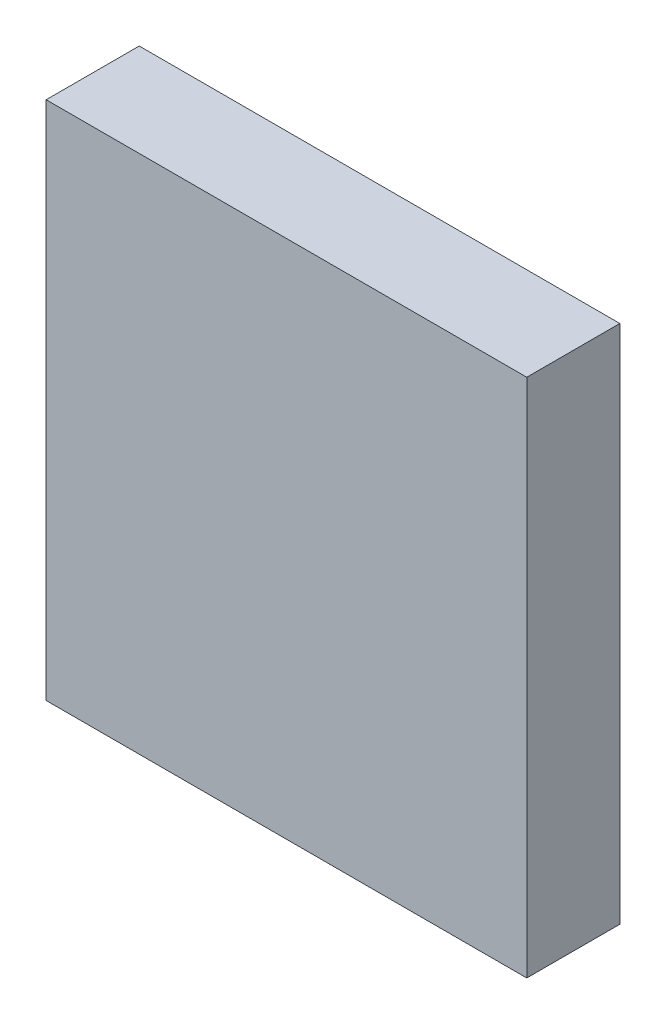
ISO-10303-21;
HEADER;
FILE_DESCRIPTION(('STEP AP214'),'2;1');
FILE_NAME('part.step','',(''),(''),'','','');
FILE_SCHEMA(('AUTOMOTIVE_DESIGN { 1 0 10303 214 1 1 1 1 }'));
ENDSEC;
DATA;
#1=APPLICATION_CONTEXT('core data for automotive mechanical design processes');
#2=APPLICATION_PROTOCOL_DEFINITION('international standard','automotive_design',2000,#1);
#3=PRODUCT_CONTEXT('',#1,'mechanical');
#4=PRODUCT('Part','Part','',(#3));
#5=PRODUCT_RELATED_PRODUCT_CATEGORY('part','',(#4));
#6=PRODUCT_DEFINITION_FORMATION('','',#4);
#7=PRODUCT_DEFINITION_CONTEXT('part definition',#1,'design');
#8=PRODUCT_DEFINITION('design','',#6,#7);
#9=PRODUCT_DEFINITION_SHAPE('','',#8);
#10=(LENGTH_UNIT() NAMED_UNIT(*) SI_UNIT(.MILLI.,.METRE.));
#11=(NAMED_UNIT(*) PLANE_ANGLE_UNIT() SI_UNIT($,.RADIAN.));
#12=(NAMED_UNIT(*) SI_UNIT($,.STERADIAN.) SOLID_ANGLE_UNIT());
#13=UNCERTAINTY_MEASURE_WITH_UNIT(LENGTH_MEASURE(1.E-05),#10,'distance_accuracy_value','');
#14=(GEOMETRIC_REPRESENTATION_CONTEXT(3) GLOBAL_UNCERTAINTY_ASSIGNED_CONTEXT((#13)) GLOBAL_UNIT_ASSIGNED_CONTEXT((#10,
#11,#12)) REPRESENTATION_CONTEXT('',''));
#15=CARTESIAN_POINT('',(0.,0.,0.));
#16=DIRECTION('',(0.,0.,1.));
#17=DIRECTION('',(1.,0.,0.));
#18=AXIS2_PLACEMENT_3D('',#15,#16,#17);
#19=CARTESIAN_POINT('',(-2.890066,-3.,1.));
#20=DIRECTION('',(1.,0.,0.));
#21=DIRECTION('',(0.,0.,-1.));
#22=AXIS2_PLACEMENT_3D('',#19,#20,#21);
#23=PLANE('',#22);
#24=DIRECTION('',(0.,-1.,0.));
#25=VECTOR('',#24,1.);
#26=CARTESIAN_POINT('',(-2.890066,-3.,0.));
#27=LINE('',#26,#25);
#28=CARTESIAN_POINT('',(-2.890066,2.590066,0.));
#29=VERTEX_POINT('',#28);
#30=CARTESIAN_POINT('',(-2.890066,-3.,0.));
#31=VERTEX_POINT('',#30);
#32=EDGE_CURVE('E96',#29,#31,#27,.T.);
#33=ORIENTED_EDGE('',*,*,#32,.T.);
#34=DIRECTION('',(0.,0.,-1.));
#35=VECTOR('',#34,1.);
#36=CARTESIAN_POINT('',(-2.890066,-3.,1.));
#37=LINE('',#36,#35);
#38=CARTESIAN_POINT('',(-2.890066,-3.,1.));
#39=VERTEX_POINT('',#38);
#40=EDGE_CURVE('E11',#39,#31,#37,.T.);
#41=ORIENTED_EDGE('',*,*,#40,.F.);
#42=DIRECTION('',(0.,-1.,0.));
#43=VECTOR('',#42,1.);
#44=CARTESIAN_POINT('',(-2.890066,-3.,1.));
#45=LINE('',#44,#43);
#46=CARTESIAN_POINT('',(-2.890066,2.590066,1.));
#47=VERTEX_POINT('',#46);
#48=EDGE_CURVE('E84',#47,#39,#45,.T.);
#49=ORIENTED_EDGE('',*,*,#48,.F.);
#50=DIRECTION('',(0.,0.,-1.));
#51=VECTOR('',#50,1.);
#52=CARTESIAN_POINT('',(-2.890066,2.590066,1.));
#53=LINE('',#52,#51);
#54=EDGE_CURVE('E92',#47,#29,#53,.T.);
#55=ORIENTED_EDGE('',*,*,#54,.T.);
#56=EDGE_LOOP('',(#33,#41,#49,#55));
#57=FACE_BOUND('',#56,.T.);
#58=ADVANCED_FACE('F33',(#57),#23,.F.);
#59=CARTESIAN_POINT('',(2.2735,-3.,1.));
#60=DIRECTION('',(0.,1.,0.));
#61=DIRECTION('',(0.,0.,1.));
#62=AXIS2_PLACEMENT_3D('',#59,#60,#61);
#63=PLANE('',#62);
#64=DIRECTION('',(1.,0.,0.));
#65=VECTOR('',#64,1.);
#66=CARTESIAN_POINT('',(2.2735,-3.,0.));
#67=LINE('',#66,#65);
#68=CARTESIAN_POINT('',(2.2735,-3.,0.));
#69=VERTEX_POINT('',#68);
#70=EDGE_CURVE('E88',#31,#69,#67,.T.);
#71=ORIENTED_EDGE('',*,*,#70,.T.);
#72=DIRECTION('',(0.,0.,-1.));
#73=VECTOR('',#72,1.);
#74=CARTESIAN_POINT('',(2.2735,-3.,1.));
#75=LINE('',#74,#73);
#76=CARTESIAN_POINT('',(2.2735,-3.,1.));
#77=VERTEX_POINT('',#76);
#78=EDGE_CURVE('E41',#77,#69,#75,.T.);
#79=ORIENTED_EDGE('',*,*,#78,.F.);
#80=DIRECTION('',(1.,0.,0.));
#81=VECTOR('',#80,1.);
#82=CARTESIAN_POINT('',(2.2735,-3.,1.));
#83=LINE('',#82,#81);
#84=EDGE_CURVE('E79',#39,#77,#83,.T.);
#85=ORIENTED_EDGE('',*,*,#84,.F.);
#86=ORIENTED_EDGE('',*,*,#40,.T.);
#87=EDGE_LOOP('',(#71,#79,#85,#86));
#88=FACE_BOUND('',#87,.T.);
#89=ADVANCED_FACE('F87',(#88),#63,.F.);
#90=CARTESIAN_POINT('',(2.2735,2.590066,1.));
#91=DIRECTION('',(-1.,0.,0.));
#92=DIRECTION('',(0.,0.,1.));
#93=AXIS2_PLACEMENT_3D('',#90,#91,#92);
#94=PLANE('',#93);
#95=DIRECTION('',(0.,1.,0.));
#96=VECTOR('',#95,1.);
#97=CARTESIAN_POINT('',(2.2735,2.590066,0.));
#98=LINE('',#97,#96);
#99=CARTESIAN_POINT('',(2.2735,2.590066,0.));
#100=VERTEX_POINT('',#99);
#101=EDGE_CURVE('E66',#69,#100,#98,.T.);
#102=ORIENTED_EDGE('',*,*,#101,.T.);
#103=DIRECTION('',(0.,0.,-1.));
#104=VECTOR('',#103,1.);
#105=CARTESIAN_POINT('',(2.2735,2.590066,1.));
#106=LINE('',#105,#104);
#107=CARTESIAN_POINT('',(2.2735,2.590066,1.));
#108=VERTEX_POINT('',#107);
#109=EDGE_CURVE('E89',#108,#100,#106,.T.);
#110=ORIENTED_EDGE('',*,*,#109,.F.);
#111=DIRECTION('',(0.,1.,0.));
#112=VECTOR('',#111,1.);
#113=CARTESIAN_POINT('',(2.2735,2.590066,1.));
#114=LINE('',#113,#112);
#115=EDGE_CURVE('E82',#77,#108,#114,.T.);
#116=ORIENTED_EDGE('',*,*,#115,.F.);
#117=ORIENTED_EDGE('',*,*,#78,.T.);
#118=EDGE_LOOP('',(#102,#110,#116,#117));
#119=FACE_BOUND('',#118,.T.);
#120=ADVANCED_FACE('F90',(#119),#94,.F.);
#121=CARTESIAN_POINT('',(-2.890066,2.590066,1.));
#122=DIRECTION('',(0.,-1.,0.));
#123=DIRECTION('',(0.,0.,-1.));
#124=AXIS2_PLACEMENT_3D('',#121,#122,#123);
#125=PLANE('',#124);
#126=DIRECTION('',(-1.,0.,0.));
#127=VECTOR('',#126,1.);
#128=CARTESIAN_POINT('',(-2.890066,2.590066,0.));
#129=LINE('',#128,#127);
#130=EDGE_CURVE('E72',#100,#29,#129,.T.);
#131=ORIENTED_EDGE('',*,*,#130,.T.);
#132=ORIENTED_EDGE('',*,*,#54,.F.);
#133=DIRECTION('',(-1.,0.,0.));
#134=VECTOR('',#133,1.);
#135=CARTESIAN_POINT('',(-2.890066,2.590066,1.));
#136=LINE('',#135,#134);
#137=EDGE_CURVE('E49',#108,#47,#136,.T.);
#138=ORIENTED_EDGE('',*,*,#137,.F.);
#139=ORIENTED_EDGE('',*,*,#109,.T.);
#140=EDGE_LOOP('',(#131,#132,#138,#139));
#141=FACE_BOUND('',#140,.T.);
#142=ADVANCED_FACE('F103',(#141),#125,.F.);
#143=CARTESIAN_POINT('',(0.,0.,1.));
#144=DIRECTION('',(0.,0.,-1.));
#145=DIRECTION('',(-1.,0.,0.));
#146=AXIS2_PLACEMENT_3D('',#143,#144,#145);
#147=PLANE('',#146);
#148=ORIENTED_EDGE('',*,*,#48,.T.);
#149=ORIENTED_EDGE('',*,*,#84,.T.);
#150=ORIENTED_EDGE('',*,*,#115,.T.);
#151=ORIENTED_EDGE('',*,*,#137,.T.);
#152=EDGE_LOOP('',(#148,#149,#150,#151));
#153=FACE_BOUND('',#152,.T.);
#154=ADVANCED_FACE('F80',(#153),#147,.F.);
#155=CARTESIAN_POINT('',(0.,0.,0.));
#156=DIRECTION('',(0.,0.,-1.));
#157=DIRECTION('',(-1.,0.,0.));
#158=AXIS2_PLACEMENT_3D('',#155,#156,#157);
#159=PLANE('',#158);
#160=ORIENTED_EDGE('',*,*,#32,.F.);
#161=ORIENTED_EDGE('',*,*,#130,.F.);
#162=ORIENTED_EDGE('',*,*,#101,.F.);
#163=ORIENTED_EDGE('',*,*,#70,.F.);
#164=EDGE_LOOP('',(#160,#161,#162,#163));
#165=FACE_BOUND('',#164,.T.);
#166=ADVANCED_FACE('F106',(#165),#159,.T.);
#167=CLOSED_SHELL('',(#58,#89,#120,#142,#154,#166));
#168=MANIFOLD_SOLID_BREP('B2',#167);
#169=ADVANCED_BREP_SHAPE_REPRESENTATION('',(#18,#168),#14);
#170=SHAPE_DEFINITION_REPRESENTATION(#9,#169);
ENDSEC;
END-ISO-10303-21;
